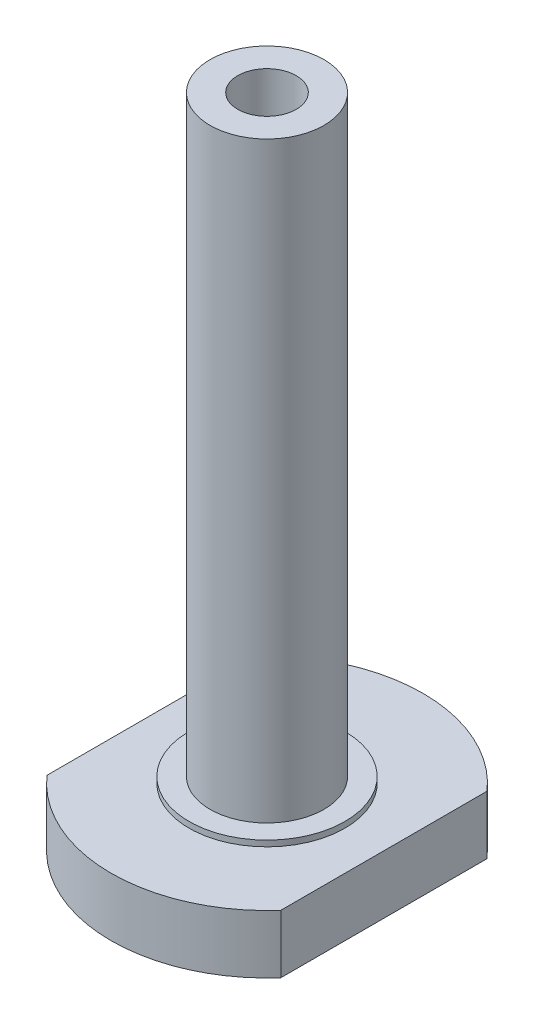
ISO-10303-21;
HEADER;
FILE_DESCRIPTION(('STEP AP214'),'2;1');
FILE_NAME('part.step','',(''),(''),'','','');
FILE_SCHEMA(('AUTOMOTIVE_DESIGN { 1 0 10303 214 1 1 1 1 }'));
ENDSEC;
DATA;
#1=APPLICATION_CONTEXT('core data for automotive mechanical design processes');
#2=APPLICATION_PROTOCOL_DEFINITION('international standard','automotive_design',2000,#1);
#3=PRODUCT_CONTEXT('',#1,'mechanical');
#4=PRODUCT('Part','Part','',(#3));
#5=PRODUCT_RELATED_PRODUCT_CATEGORY('part','',(#4));
#6=PRODUCT_DEFINITION_FORMATION('','',#4);
#7=PRODUCT_DEFINITION_CONTEXT('part definition',#1,'design');
#8=PRODUCT_DEFINITION('design','',#6,#7);
#9=PRODUCT_DEFINITION_SHAPE('','',#8);
#10=(LENGTH_UNIT() NAMED_UNIT(*) SI_UNIT(.MILLI.,.METRE.));
#11=(NAMED_UNIT(*) PLANE_ANGLE_UNIT() SI_UNIT($,.RADIAN.));
#12=(NAMED_UNIT(*) SI_UNIT($,.STERADIAN.) SOLID_ANGLE_UNIT());
#13=UNCERTAINTY_MEASURE_WITH_UNIT(LENGTH_MEASURE(1.E-05),#10,'distance_accuracy_value','');
#14=(GEOMETRIC_REPRESENTATION_CONTEXT(3) GLOBAL_UNCERTAINTY_ASSIGNED_CONTEXT((#13)) GLOBAL_UNIT_ASSIGNED_CONTEXT((#10,
#11,#12)) REPRESENTATION_CONTEXT('',''));
#15=CARTESIAN_POINT('',(0.,0.,0.));
#16=DIRECTION('',(0.,0.,1.));
#17=DIRECTION('',(1.,0.,0.));
#18=AXIS2_PLACEMENT_3D('',#15,#16,#17);
#19=CARTESIAN_POINT('',(-8.,0.,0.));
#20=DIRECTION('',(0.,1.,0.));
#21=DIRECTION('',(0.,0.,1.));
#22=AXIS2_PLACEMENT_3D('',#19,#20,#21);
#23=PLANE('',#22);
#24=CARTESIAN_POINT('',(0.,0.,0.));
#25=DIRECTION('',(0.,-1.,0.));
#26=DIRECTION('',(0.,0.,-1.));
#27=AXIS2_PLACEMENT_3D('',#24,#25,#26);
#28=CIRCLE('',#27,1.5);
#29=CARTESIAN_POINT('',(0.,0.,-1.5));
#30=VERTEX_POINT('',#29);
#31=EDGE_CURVE('E11',#30,#30,#28,.T.);
#32=ORIENTED_EDGE('',*,*,#31,.F.);
#33=EDGE_LOOP('',(#32));
#34=FACE_BOUND('',#33,.T.);
#35=DIRECTION('',(0.,0.,-1.));
#36=VECTOR('',#35,1.);
#37=CARTESIAN_POINT('',(-6.,0.,0.));
#38=LINE('',#37,#36);
#39=CARTESIAN_POINT('',(-6.,0.,5.29150262212918));
#40=VERTEX_POINT('',#39);
#41=CARTESIAN_POINT('',(-6.,0.,-5.29150262212918));
#42=VERTEX_POINT('',#41);
#43=EDGE_CURVE('E54',#40,#42,#38,.T.);
#44=ORIENTED_EDGE('',*,*,#43,.T.);
#45=CARTESIAN_POINT('',(0.,0.,0.));
#46=DIRECTION('',(0.,-1.,0.));
#47=DIRECTION('',(0.,0.,-1.));
#48=AXIS2_PLACEMENT_3D('',#45,#46,#47);
#49=CIRCLE('',#48,8.);
#50=CARTESIAN_POINT('',(6.,0.,-5.29150262212918));
#51=VERTEX_POINT('',#50);
#52=EDGE_CURVE('E137',#42,#51,#49,.T.);
#53=ORIENTED_EDGE('',*,*,#52,.T.);
#54=DIRECTION('',(0.,0.,-1.));
#55=VECTOR('',#54,1.);
#56=CARTESIAN_POINT('',(6.,0.,0.));
#57=LINE('',#56,#55);
#58=CARTESIAN_POINT('',(6.,0.,5.29150262212918));
#59=VERTEX_POINT('',#58);
#60=EDGE_CURVE('E152',#59,#51,#57,.T.);
#61=ORIENTED_EDGE('',*,*,#60,.F.);
#62=EDGE_CURVE('E108',#59,#40,#49,.T.);
#63=ORIENTED_EDGE('',*,*,#62,.T.);
#64=EDGE_LOOP('',(#44,#53,#61,#63));
#65=FACE_BOUND('',#64,.T.);
#66=ADVANCED_FACE('F39',(#34,#65),#23,.F.);
#67=CARTESIAN_POINT('',(-4.,3.,0.));
#68=DIRECTION('',(0.,-1.,0.));
#69=DIRECTION('',(0.,0.,-1.));
#70=AXIS2_PLACEMENT_3D('',#67,#68,#69);
#71=PLANE('',#70);
#72=CARTESIAN_POINT('',(0.,3.,0.));
#73=DIRECTION('',(0.,-1.,0.));
#74=DIRECTION('',(0.,0.,-1.));
#75=AXIS2_PLACEMENT_3D('',#72,#73,#74);
#76=CIRCLE('',#75,4.);
#77=CARTESIAN_POINT('',(0.,3.,-4.));
#78=VERTEX_POINT('',#77);
#79=EDGE_CURVE('E101',#78,#78,#76,.T.);
#80=ORIENTED_EDGE('',*,*,#79,.T.);
#81=EDGE_LOOP('',(#80));
#82=FACE_BOUND('',#81,.T.);
#83=DIRECTION('',(0.,0.,1.));
#84=VECTOR('',#83,1.);
#85=CARTESIAN_POINT('',(-6.,3.,0.));
#86=LINE('',#85,#84);
#87=CARTESIAN_POINT('',(-6.,3.,-5.29150262212918));
#88=VERTEX_POINT('',#87);
#89=CARTESIAN_POINT('',(-6.,3.,5.29150262212918));
#90=VERTEX_POINT('',#89);
#91=EDGE_CURVE('E81',#88,#90,#86,.T.);
#92=ORIENTED_EDGE('',*,*,#91,.T.);
#93=CARTESIAN_POINT('',(0.,3.,0.));
#94=DIRECTION('',(0.,-1.,0.));
#95=DIRECTION('',(0.,0.,-1.));
#96=AXIS2_PLACEMENT_3D('',#93,#94,#95);
#97=CIRCLE('',#96,8.);
#98=CARTESIAN_POINT('',(6.,3.,5.29150262212918));
#99=VERTEX_POINT('',#98);
#100=EDGE_CURVE('E94',#99,#90,#97,.T.);
#101=ORIENTED_EDGE('',*,*,#100,.F.);
#102=DIRECTION('',(0.,0.,1.));
#103=VECTOR('',#102,1.);
#104=CARTESIAN_POINT('',(6.,3.,0.));
#105=LINE('',#104,#103);
#106=CARTESIAN_POINT('',(6.,3.,-5.29150262212918));
#107=VERTEX_POINT('',#106);
#108=EDGE_CURVE('E62',#107,#99,#105,.T.);
#109=ORIENTED_EDGE('',*,*,#108,.F.);
#110=EDGE_CURVE('E95',#88,#107,#97,.T.);
#111=ORIENTED_EDGE('',*,*,#110,.F.);
#112=EDGE_LOOP('',(#92,#101,#109,#111));
#113=FACE_BOUND('',#112,.T.);
#114=ADVANCED_FACE('F93',(#82,#113),#71,.F.);
#115=CARTESIAN_POINT('',(0.,-3.66464597478176,0.));
#116=DIRECTION('',(0.,-1.,0.));
#117=DIRECTION('',(0.,0.,-1.));
#118=AXIS2_PLACEMENT_3D('',#115,#116,#117);
#119=CYLINDRICAL_SURFACE('',#118,8.);
#120=DIRECTION('',(0.,-1.,0.));
#121=VECTOR('',#120,1.);
#122=CARTESIAN_POINT('',(-6.,33.701,-5.29150262212918));
#123=LINE('',#122,#121);
#124=EDGE_CURVE('E88',#88,#42,#123,.T.);
#125=ORIENTED_EDGE('',*,*,#124,.F.);
#126=ORIENTED_EDGE('',*,*,#110,.T.);
#127=DIRECTION('',(0.,-1.,0.));
#128=VECTOR('',#127,1.);
#129=CARTESIAN_POINT('',(6.,33.701,-5.29150262212918));
#130=LINE('',#129,#128);
#131=EDGE_CURVE('E144',#107,#51,#130,.T.);
#132=ORIENTED_EDGE('',*,*,#131,.T.);
#133=ORIENTED_EDGE('',*,*,#52,.F.);
#134=EDGE_LOOP('',(#125,#126,#132,#133));
#135=FACE_BOUND('',#134,.T.);
#136=ADVANCED_FACE('F143',(#135),#119,.T.);
#137=DIRECTION('',(0.,-1.,0.));
#138=VECTOR('',#137,1.);
#139=CARTESIAN_POINT('',(-6.,33.701,5.29150262212918));
#140=LINE('',#139,#138);
#141=EDGE_CURVE('E78',#90,#40,#140,.T.);
#142=ORIENTED_EDGE('',*,*,#141,.T.);
#143=ORIENTED_EDGE('',*,*,#62,.F.);
#144=DIRECTION('',(0.,-1.,0.));
#145=VECTOR('',#144,1.);
#146=CARTESIAN_POINT('',(6.,33.701,5.29150262212918));
#147=LINE('',#146,#145);
#148=EDGE_CURVE('E99',#99,#59,#147,.T.);
#149=ORIENTED_EDGE('',*,*,#148,.F.);
#150=ORIENTED_EDGE('',*,*,#100,.T.);
#151=EDGE_LOOP('',(#142,#143,#149,#150));
#152=FACE_BOUND('',#151,.T.);
#153=ADVANCED_FACE('F98',(#152),#119,.T.);
#154=CARTESIAN_POINT('',(0.,-3.66464597478176,0.));
#155=DIRECTION('',(0.,-1.,0.));
#156=DIRECTION('',(0.,0.,-1.));
#157=AXIS2_PLACEMENT_3D('',#154,#155,#156);
#158=CYLINDRICAL_SURFACE('',#157,1.5);
#159=CARTESIAN_POINT('',(0.,33.7,0.));
#160=DIRECTION('',(0.,-1.,0.));
#161=DIRECTION('',(0.,0.,-1.));
#162=AXIS2_PLACEMENT_3D('',#159,#160,#161);
#163=CIRCLE('',#162,1.5);
#164=CARTESIAN_POINT('',(0.,33.7,-1.5));
#165=VERTEX_POINT('',#164);
#166=EDGE_CURVE('E47',#165,#165,#163,.T.);
#167=ORIENTED_EDGE('',*,*,#166,.F.);
#168=EDGE_LOOP('',(#167));
#169=FACE_BOUND('',#168,.T.);
#170=ORIENTED_EDGE('',*,*,#31,.T.);
#171=EDGE_LOOP('',(#170));
#172=FACE_BOUND('',#171,.T.);
#173=ADVANCED_FACE('F128',(#169,#172),#158,.F.);
#174=CARTESIAN_POINT('',(-1.5,33.7,0.));
#175=DIRECTION('',(0.,-1.,0.));
#176=DIRECTION('',(0.,0.,-1.));
#177=AXIS2_PLACEMENT_3D('',#174,#175,#176);
#178=PLANE('',#177);
#179=CARTESIAN_POINT('',(0.,33.7,0.));
#180=DIRECTION('',(0.,-1.,0.));
#181=DIRECTION('',(0.,0.,-1.));
#182=AXIS2_PLACEMENT_3D('',#179,#180,#181);
#183=CIRCLE('',#182,2.925);
#184=CARTESIAN_POINT('',(0.,33.7,-2.925));
#185=VERTEX_POINT('',#184);
#186=EDGE_CURVE('E119',#185,#185,#183,.T.);
#187=ORIENTED_EDGE('',*,*,#186,.F.);
#188=EDGE_LOOP('',(#187));
#189=FACE_BOUND('',#188,.T.);
#190=ORIENTED_EDGE('',*,*,#166,.T.);
#191=EDGE_LOOP('',(#190));
#192=FACE_BOUND('',#191,.T.);
#193=ADVANCED_FACE('F126',(#189,#192),#178,.F.);
#194=CARTESIAN_POINT('',(0.,-3.66464597478176,0.));
#195=DIRECTION('',(0.,-1.,0.));
#196=DIRECTION('',(0.,0.,-1.));
#197=AXIS2_PLACEMENT_3D('',#194,#195,#196);
#198=CYLINDRICAL_SURFACE('',#197,2.925);
#199=CARTESIAN_POINT('',(0.,3.3,0.));
#200=DIRECTION('',(0.,-1.,0.));
#201=DIRECTION('',(0.,0.,-1.));
#202=AXIS2_PLACEMENT_3D('',#199,#200,#201);
#203=CIRCLE('',#202,2.925);
#204=CARTESIAN_POINT('',(0.,3.3,-2.925));
#205=VERTEX_POINT('',#204);
#206=EDGE_CURVE('E115',#205,#205,#203,.T.);
#207=ORIENTED_EDGE('',*,*,#206,.F.);
#208=EDGE_LOOP('',(#207));
#209=FACE_BOUND('',#208,.T.);
#210=ORIENTED_EDGE('',*,*,#186,.T.);
#211=EDGE_LOOP('',(#210));
#212=FACE_BOUND('',#211,.T.);
#213=ADVANCED_FACE('F177',(#209,#212),#198,.T.);
#214=CARTESIAN_POINT('',(-2.925,3.3,0.));
#215=DIRECTION('',(0.,-1.,0.));
#216=DIRECTION('',(0.,0.,-1.));
#217=AXIS2_PLACEMENT_3D('',#214,#215,#216);
#218=PLANE('',#217);
#219=CARTESIAN_POINT('',(0.,3.3,0.));
#220=DIRECTION('',(0.,-1.,0.));
#221=DIRECTION('',(0.,0.,-1.));
#222=AXIS2_PLACEMENT_3D('',#219,#220,#221);
#223=CIRCLE('',#222,4.);
#224=CARTESIAN_POINT('',(0.,3.3,-4.));
#225=VERTEX_POINT('',#224);
#226=EDGE_CURVE('E106',#225,#225,#223,.T.);
#227=ORIENTED_EDGE('',*,*,#226,.F.);
#228=EDGE_LOOP('',(#227));
#229=FACE_BOUND('',#228,.T.);
#230=ORIENTED_EDGE('',*,*,#206,.T.);
#231=EDGE_LOOP('',(#230));
#232=FACE_BOUND('',#231,.T.);
#233=ADVANCED_FACE('F166',(#229,#232),#218,.F.);
#234=CARTESIAN_POINT('',(0.,-3.66464597478176,0.));
#235=DIRECTION('',(0.,-1.,0.));
#236=DIRECTION('',(0.,0.,-1.));
#237=AXIS2_PLACEMENT_3D('',#234,#235,#236);
#238=CYLINDRICAL_SURFACE('',#237,4.);
#239=ORIENTED_EDGE('',*,*,#79,.F.);
#240=EDGE_LOOP('',(#239));
#241=FACE_BOUND('',#240,.T.);
#242=ORIENTED_EDGE('',*,*,#226,.T.);
#243=EDGE_LOOP('',(#242));
#244=FACE_BOUND('',#243,.T.);
#245=ADVANCED_FACE('F159',(#241,#244),#238,.T.);
#246=CARTESIAN_POINT('',(6.,33.701,0.));
#247=DIRECTION('',(-1.,0.,0.));
#248=DIRECTION('',(0.,0.,1.));
#249=AXIS2_PLACEMENT_3D('',#246,#247,#248);
#250=PLANE('',#249);
#251=ORIENTED_EDGE('',*,*,#108,.T.);
#252=ORIENTED_EDGE('',*,*,#148,.T.);
#253=ORIENTED_EDGE('',*,*,#60,.T.);
#254=ORIENTED_EDGE('',*,*,#131,.F.);
#255=EDGE_LOOP('',(#251,#252,#253,#254));
#256=FACE_BOUND('',#255,.T.);
#257=ADVANCED_FACE('F157',(#256),#250,.F.);
#258=CARTESIAN_POINT('',(-6.,33.701,0.));
#259=DIRECTION('',(-1.,0.,0.));
#260=DIRECTION('',(0.,0.,1.));
#261=AXIS2_PLACEMENT_3D('',#258,#259,#260);
#262=PLANE('',#261);
#263=ORIENTED_EDGE('',*,*,#124,.T.);
#264=ORIENTED_EDGE('',*,*,#43,.F.);
#265=ORIENTED_EDGE('',*,*,#141,.F.);
#266=ORIENTED_EDGE('',*,*,#91,.F.);
#267=EDGE_LOOP('',(#263,#264,#265,#266));
#268=FACE_BOUND('',#267,.T.);
#269=ADVANCED_FACE('F80',(#268),#262,.T.);
#270=CLOSED_SHELL('',(#66,#114,#136,#153,#173,#193,#213,#233,#245,#257,#269));
#271=MANIFOLD_SOLID_BREP('B2',#270);
#272=ADVANCED_BREP_SHAPE_REPRESENTATION('',(#18,#271),#14);
#273=SHAPE_DEFINITION_REPRESENTATION(#9,#272);
ENDSEC;
END-ISO-10303-21;
